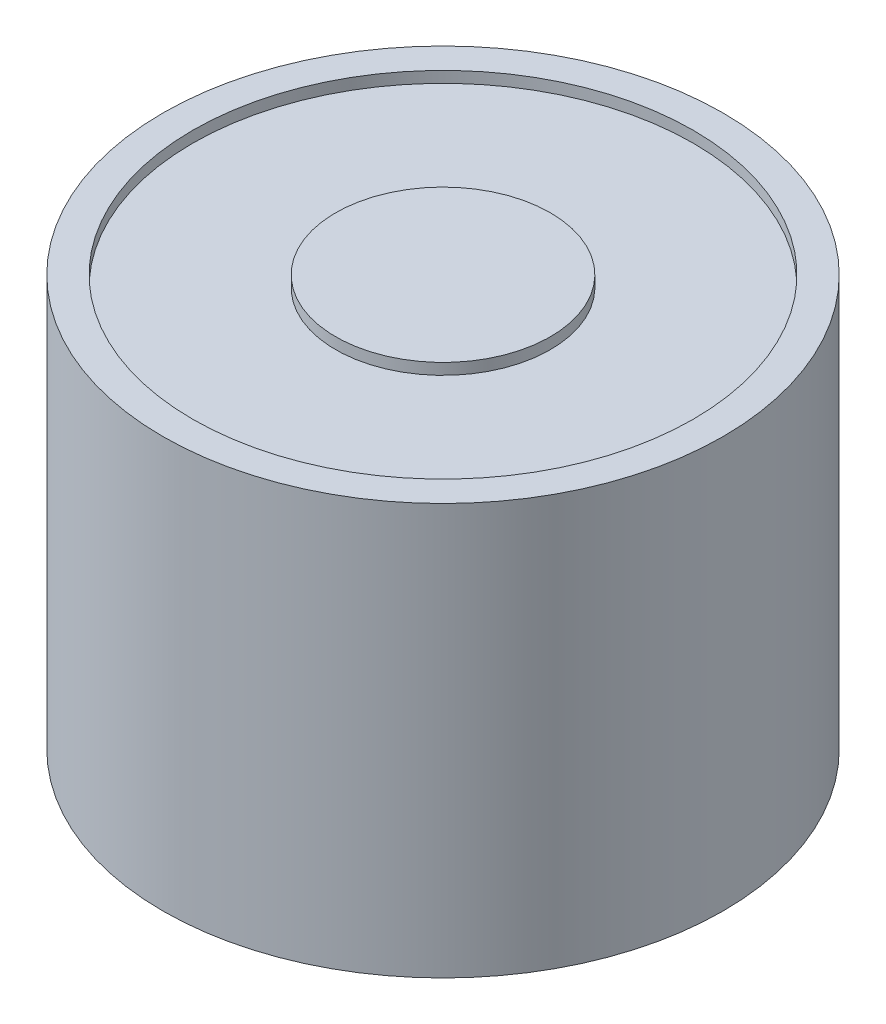
ISO-10303-21;
HEADER;
FILE_DESCRIPTION(('STEP AP214'),'2;1');
FILE_NAME('part.step','',(''),(''),'','','');
FILE_SCHEMA(('AUTOMOTIVE_DESIGN { 1 0 10303 214 1 1 1 1 }'));
ENDSEC;
DATA;
#1=APPLICATION_CONTEXT('core data for automotive mechanical design processes');
#2=APPLICATION_PROTOCOL_DEFINITION('international standard','automotive_design',2000,#1);
#3=PRODUCT_CONTEXT('',#1,'mechanical');
#4=PRODUCT('Part','Part','',(#3));
#5=PRODUCT_RELATED_PRODUCT_CATEGORY('part','',(#4));
#6=PRODUCT_DEFINITION_FORMATION('','',#4);
#7=PRODUCT_DEFINITION_CONTEXT('part definition',#1,'design');
#8=PRODUCT_DEFINITION('design','',#6,#7);
#9=PRODUCT_DEFINITION_SHAPE('','',#8);
#10=(LENGTH_UNIT() NAMED_UNIT(*) SI_UNIT(.MILLI.,.METRE.));
#11=(NAMED_UNIT(*) PLANE_ANGLE_UNIT() SI_UNIT($,.RADIAN.));
#12=(NAMED_UNIT(*) SI_UNIT($,.STERADIAN.) SOLID_ANGLE_UNIT());
#13=UNCERTAINTY_MEASURE_WITH_UNIT(LENGTH_MEASURE(1.E-05),#10,'distance_accuracy_value','');
#14=(GEOMETRIC_REPRESENTATION_CONTEXT(3) GLOBAL_UNCERTAINTY_ASSIGNED_CONTEXT((#13)) GLOBAL_UNIT_ASSIGNED_CONTEXT((#10,
#11,#12)) REPRESENTATION_CONTEXT('',''));
#15=CARTESIAN_POINT('',(0.,0.,0.));
#16=DIRECTION('',(0.,0.,1.));
#17=DIRECTION('',(1.,0.,0.));
#18=AXIS2_PLACEMENT_3D('',#15,#16,#17);
#19=CARTESIAN_POINT('',(2.,6.,0.));
#20=DIRECTION('',(0.,-1.,0.));
#21=DIRECTION('',(0.,0.,-1.));
#22=AXIS2_PLACEMENT_3D('',#19,#20,#21);
#23=PLANE('',#22);
#24=CARTESIAN_POINT('',(0.,6.,0.));
#25=DIRECTION('',(0.,-1.,0.));
#26=DIRECTION('',(0.,0.,-1.));
#27=AXIS2_PLACEMENT_3D('',#24,#25,#26);
#28=CIRCLE('',#27,2.);
#29=CARTESIAN_POINT('',(0.,6.,-2.));
#30=VERTEX_POINT('',#29);
#31=EDGE_CURVE('E72',#30,#30,#28,.T.);
#32=ORIENTED_EDGE('',*,*,#31,.T.);
#33=EDGE_LOOP('',(#32));
#34=FACE_BOUND('',#33,.T.);
#35=ADVANCED_FACE('F37',(#34),#23,.T.);
#36=CARTESIAN_POINT('',(0.,22.,0.));
#37=DIRECTION('',(0.,1.,0.));
#38=DIRECTION('',(0.,0.,1.));
#39=AXIS2_PLACEMENT_3D('',#36,#37,#38);
#40=PLANE('',#39);
#41=CARTESIAN_POINT('',(0.,22.,0.));
#42=DIRECTION('',(0.,-1.,0.));
#43=DIRECTION('',(0.,0.,-1.));
#44=AXIS2_PLACEMENT_3D('',#41,#42,#43);
#45=CIRCLE('',#44,5.75);
#46=CARTESIAN_POINT('',(0.,22.,-5.75));
#47=VERTEX_POINT('',#46);
#48=EDGE_CURVE('E10',#47,#47,#45,.T.);
#49=ORIENTED_EDGE('',*,*,#48,.F.);
#50=EDGE_LOOP('',(#49));
#51=FACE_BOUND('',#50,.T.);
#52=ADVANCED_FACE('F90',(#51),#40,.T.);
#53=CARTESIAN_POINT('',(0.,-2.82692307692308,0.));
#54=DIRECTION('',(0.,-1.,0.));
#55=DIRECTION('',(0.,0.,-1.));
#56=AXIS2_PLACEMENT_3D('',#53,#54,#55);
#57=CYLINDRICAL_SURFACE('',#56,5.75);
#58=ORIENTED_EDGE('',*,*,#48,.T.);
#59=EDGE_LOOP('',(#58));
#60=FACE_BOUND('',#59,.T.);
#61=CARTESIAN_POINT('',(0.,21.4,0.));
#62=DIRECTION('',(0.,-1.,0.));
#63=DIRECTION('',(0.,0.,-1.));
#64=AXIS2_PLACEMENT_3D('',#61,#62,#63);
#65=CIRCLE('',#64,5.75);
#66=CARTESIAN_POINT('',(0.,21.4,-5.75));
#67=VERTEX_POINT('',#66);
#68=EDGE_CURVE('E44',#67,#67,#65,.T.);
#69=ORIENTED_EDGE('',*,*,#68,.F.);
#70=EDGE_LOOP('',(#69));
#71=FACE_BOUND('',#70,.T.);
#72=ADVANCED_FACE('F94',(#60,#71),#57,.T.);
#73=CARTESIAN_POINT('',(5.75,21.4,0.));
#74=DIRECTION('',(0.,1.,0.));
#75=DIRECTION('',(0.,0.,1.));
#76=AXIS2_PLACEMENT_3D('',#73,#74,#75);
#77=PLANE('',#76);
#78=ORIENTED_EDGE('',*,*,#68,.T.);
#79=EDGE_LOOP('',(#78));
#80=FACE_BOUND('',#79,.T.);
#81=CARTESIAN_POINT('',(0.,21.4,0.));
#82=DIRECTION('',(0.,-1.,0.));
#83=DIRECTION('',(0.,0.,-1.));
#84=AXIS2_PLACEMENT_3D('',#81,#82,#83);
#85=CIRCLE('',#84,13.4);
#86=CARTESIAN_POINT('',(0.,21.4,-13.4));
#87=VERTEX_POINT('',#86);
#88=EDGE_CURVE('E49',#87,#87,#85,.T.);
#89=ORIENTED_EDGE('',*,*,#88,.F.);
#90=EDGE_LOOP('',(#89));
#91=FACE_BOUND('',#90,.T.);
#92=ADVANCED_FACE('F99',(#80,#91),#77,.T.);
#93=CARTESIAN_POINT('',(0.,-2.82692307692308,0.));
#94=DIRECTION('',(0.,-1.,0.));
#95=DIRECTION('',(0.,0.,-1.));
#96=AXIS2_PLACEMENT_3D('',#93,#94,#95);
#97=CYLINDRICAL_SURFACE('',#96,13.4);
#98=ORIENTED_EDGE('',*,*,#88,.T.);
#99=EDGE_LOOP('',(#98));
#100=FACE_BOUND('',#99,.T.);
#101=CARTESIAN_POINT('',(0.,22.,0.));
#102=DIRECTION('',(0.,-1.,0.));
#103=DIRECTION('',(0.,0.,-1.));
#104=AXIS2_PLACEMENT_3D('',#101,#102,#103);
#105=CIRCLE('',#104,13.4);
#106=CARTESIAN_POINT('',(0.,22.,-13.4));
#107=VERTEX_POINT('',#106);
#108=EDGE_CURVE('E54',#107,#107,#105,.T.);
#109=ORIENTED_EDGE('',*,*,#108,.F.);
#110=EDGE_LOOP('',(#109));
#111=FACE_BOUND('',#110,.T.);
#112=ADVANCED_FACE('F104',(#100,#111),#97,.F.);
#113=CARTESIAN_POINT('',(13.4,22.,0.));
#114=DIRECTION('',(0.,1.,0.));
#115=DIRECTION('',(0.,0.,1.));
#116=AXIS2_PLACEMENT_3D('',#113,#114,#115);
#117=PLANE('',#116);
#118=ORIENTED_EDGE('',*,*,#108,.T.);
#119=EDGE_LOOP('',(#118));
#120=FACE_BOUND('',#119,.T.);
#121=CARTESIAN_POINT('',(0.,22.,0.));
#122=DIRECTION('',(0.,-1.,0.));
#123=DIRECTION('',(0.,0.,-1.));
#124=AXIS2_PLACEMENT_3D('',#121,#122,#123);
#125=CIRCLE('',#124,15.);
#126=CARTESIAN_POINT('',(0.,22.,-15.));
#127=VERTEX_POINT('',#126);
#128=EDGE_CURVE('E60',#127,#127,#125,.T.);
#129=ORIENTED_EDGE('',*,*,#128,.F.);
#130=EDGE_LOOP('',(#129));
#131=FACE_BOUND('',#130,.T.);
#132=ADVANCED_FACE('F107',(#120,#131),#117,.T.);
#133=CARTESIAN_POINT('',(0.,-2.82692307692308,0.));
#134=DIRECTION('',(0.,-1.,0.));
#135=DIRECTION('',(0.,0.,-1.));
#136=AXIS2_PLACEMENT_3D('',#133,#134,#135);
#137=CYLINDRICAL_SURFACE('',#136,15.);
#138=ORIENTED_EDGE('',*,*,#128,.T.);
#139=EDGE_LOOP('',(#138));
#140=FACE_BOUND('',#139,.T.);
#141=CARTESIAN_POINT('',(0.,0.,0.));
#142=DIRECTION('',(0.,-1.,0.));
#143=DIRECTION('',(0.,0.,-1.));
#144=AXIS2_PLACEMENT_3D('',#141,#142,#143);
#145=CIRCLE('',#144,15.);
#146=CARTESIAN_POINT('',(0.,0.,-15.));
#147=VERTEX_POINT('',#146);
#148=EDGE_CURVE('E64',#147,#147,#145,.T.);
#149=ORIENTED_EDGE('',*,*,#148,.F.);
#150=EDGE_LOOP('',(#149));
#151=FACE_BOUND('',#150,.T.);
#152=ADVANCED_FACE('F86',(#140,#151),#137,.T.);
#153=CARTESIAN_POINT('',(15.,0.,0.));
#154=DIRECTION('',(0.,-1.,0.));
#155=DIRECTION('',(0.,0.,-1.));
#156=AXIS2_PLACEMENT_3D('',#153,#154,#155);
#157=PLANE('',#156);
#158=ORIENTED_EDGE('',*,*,#148,.T.);
#159=EDGE_LOOP('',(#158));
#160=FACE_BOUND('',#159,.T.);
#161=CARTESIAN_POINT('',(0.,0.,0.));
#162=DIRECTION('',(0.,-1.,0.));
#163=DIRECTION('',(0.,0.,-1.));
#164=AXIS2_PLACEMENT_3D('',#161,#162,#163);
#165=CIRCLE('',#164,2.);
#166=CARTESIAN_POINT('',(0.,0.,-2.));
#167=VERTEX_POINT('',#166);
#168=EDGE_CURVE('E68',#167,#167,#165,.T.);
#169=ORIENTED_EDGE('',*,*,#168,.F.);
#170=EDGE_LOOP('',(#169));
#171=FACE_BOUND('',#170,.T.);
#172=ADVANCED_FACE('F80',(#160,#171),#157,.T.);
#173=CARTESIAN_POINT('',(0.,-2.82692307692308,0.));
#174=DIRECTION('',(0.,-1.,0.));
#175=DIRECTION('',(0.,0.,-1.));
#176=AXIS2_PLACEMENT_3D('',#173,#174,#175);
#177=CYLINDRICAL_SURFACE('',#176,2.);
#178=ORIENTED_EDGE('',*,*,#168,.T.);
#179=EDGE_LOOP('',(#178));
#180=FACE_BOUND('',#179,.T.);
#181=ORIENTED_EDGE('',*,*,#31,.F.);
#182=EDGE_LOOP('',(#181));
#183=FACE_BOUND('',#182,.T.);
#184=ADVANCED_FACE('F78',(#180,#183),#177,.F.);
#185=CLOSED_SHELL('',(#35,#52,#72,#92,#112,#132,#152,#172,#184));
#186=MANIFOLD_SOLID_BREP('B2',#185);
#187=ADVANCED_BREP_SHAPE_REPRESENTATION('',(#18,#186),#14);
#188=SHAPE_DEFINITION_REPRESENTATION(#9,#187);
ENDSEC;
END-ISO-10303-21;
